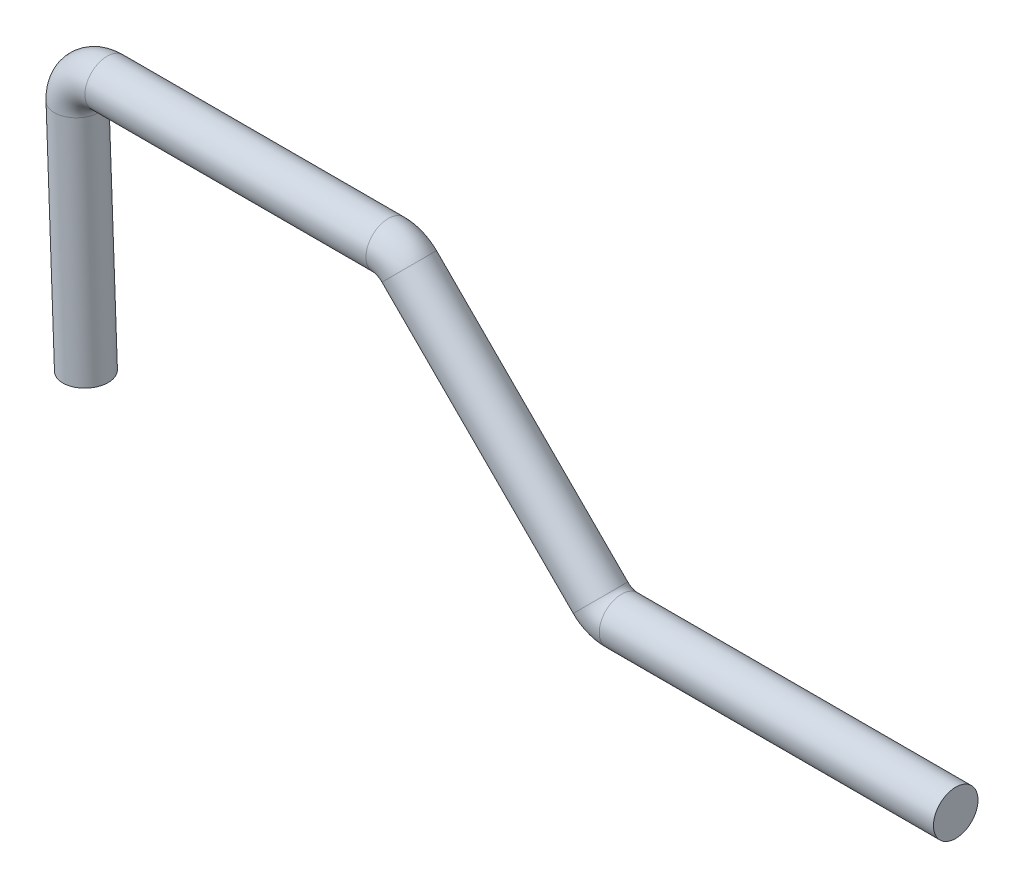
ISO-10303-21;
HEADER;
FILE_DESCRIPTION(('STEP AP214'),'2;1');
FILE_NAME('part.step','',(''),(''),'','','');
FILE_SCHEMA(('AUTOMOTIVE_DESIGN { 1 0 10303 214 1 1 1 1 }'));
ENDSEC;
DATA;
#1=APPLICATION_CONTEXT('core data for automotive mechanical design processes');
#2=APPLICATION_PROTOCOL_DEFINITION('international standard','automotive_design',2000,#1);
#3=PRODUCT_CONTEXT('',#1,'mechanical');
#4=PRODUCT('Part','Part','',(#3));
#5=PRODUCT_RELATED_PRODUCT_CATEGORY('part','',(#4));
#6=PRODUCT_DEFINITION_FORMATION('','',#4);
#7=PRODUCT_DEFINITION_CONTEXT('part definition',#1,'design');
#8=PRODUCT_DEFINITION('design','',#6,#7);
#9=PRODUCT_DEFINITION_SHAPE('','',#8);
#10=(LENGTH_UNIT() NAMED_UNIT(*) SI_UNIT(.MILLI.,.METRE.));
#11=(NAMED_UNIT(*) PLANE_ANGLE_UNIT() SI_UNIT($,.RADIAN.));
#12=(NAMED_UNIT(*) SI_UNIT($,.STERADIAN.) SOLID_ANGLE_UNIT());
#13=UNCERTAINTY_MEASURE_WITH_UNIT(LENGTH_MEASURE(1.E-05),#10,'distance_accuracy_value','');
#14=(GEOMETRIC_REPRESENTATION_CONTEXT(3) GLOBAL_UNCERTAINTY_ASSIGNED_CONTEXT((#13)) GLOBAL_UNIT_ASSIGNED_CONTEXT((#10,
#11,#12)) REPRESENTATION_CONTEXT('',''));
#15=CARTESIAN_POINT('',(0.,0.,0.));
#16=DIRECTION('',(0.,0.,1.));
#17=DIRECTION('',(1.,0.,0.));
#18=AXIS2_PLACEMENT_3D('',#15,#16,#17);
#19=CARTESIAN_POINT('',(0.,0.,0.));
#20=DIRECTION('',(1.,0.,0.));
#21=DIRECTION('',(0.,0.,-1.));
#22=AXIS2_PLACEMENT_3D('',#19,#20,#21);
#23=PLANE('',#22);
#24=CARTESIAN_POINT('',(0.,0.,0.));
#25=DIRECTION('',(1.,0.,0.));
#26=DIRECTION('',(0.,0.,-1.));
#27=AXIS2_PLACEMENT_3D('',#24,#25,#26);
#28=CIRCLE('',#27,7.5);
#29=CARTESIAN_POINT('',(0.,0.,-7.5));
#30=VERTEX_POINT('',#29);
#31=EDGE_CURVE('E59',#30,#30,#28,.T.);
#32=ORIENTED_EDGE('',*,*,#31,.T.);
#33=EDGE_LOOP('',(#32));
#34=FACE_BOUND('',#33,.T.);
#35=ADVANCED_FACE('F31',(#34),#23,.T.);
#36=CARTESIAN_POINT('',(-292.90806010988,-17.5079670244998,0.));
#37=DIRECTION('',(-0.0369440322759263,0.999317336224683,0.));
#38=DIRECTION('',(0.,0.,-1.));
#39=AXIS2_PLACEMENT_3D('',#36,#37,#38);
#40=PLANE('',#39);
#41=CARTESIAN_POINT('',(-292.90806010988,-17.5079670244998,0.));
#42=DIRECTION('',(-0.0369440322759263,0.999317336224683,0.));
#43=DIRECTION('',(0.,0.,-1.));
#44=AXIS2_PLACEMENT_3D('',#41,#42,#43);
#45=CIRCLE('',#44,7.5);
#46=CARTESIAN_POINT('',(-292.90806010988,-17.5079670244998,-7.5));
#47=VERTEX_POINT('',#46);
#48=EDGE_CURVE('E10',#47,#47,#45,.T.);
#49=ORIENTED_EDGE('',*,*,#48,.F.);
#50=EDGE_LOOP('',(#49));
#51=FACE_BOUND('',#50,.T.);
#52=ADVANCED_FACE('F67',(#51),#40,.F.);
#53=CARTESIAN_POINT('',(0.,0.,0.));
#54=DIRECTION('',(-1.,0.,0.));
#55=DIRECTION('',(0.,0.,1.));
#56=AXIS2_PLACEMENT_3D('',#53,#54,#55);
#57=CYLINDRICAL_SURFACE('',#56,7.5);
#58=CARTESIAN_POINT('',(-112.552079249219,0.,0.));
#59=DIRECTION('',(1.,0.,0.));
#60=DIRECTION('',(0.,0.,-1.));
#61=AXIS2_PLACEMENT_3D('',#58,#59,#60);
#62=CIRCLE('',#61,7.5);
#63=CARTESIAN_POINT('',(-112.552079249219,-7.5,0.));
#64=VERTEX_POINT('',#63);
#65=EDGE_CURVE('E56',#64,#64,#62,.T.);
#66=ORIENTED_EDGE('',*,*,#65,.T.);
#67=EDGE_LOOP('',(#66));
#68=FACE_BOUND('',#67,.T.);
#69=ORIENTED_EDGE('',*,*,#31,.F.);
#70=EDGE_LOOP('',(#69));
#71=FACE_BOUND('',#70,.T.);
#72=ADVANCED_FACE('F64',(#68,#71),#57,.T.);
#73=CARTESIAN_POINT('',(-112.552079249219,10.,0.));
#74=DIRECTION('',(0.,0.,-1.));
#75=DIRECTION('',(-1.,0.,0.));
#76=AXIS2_PLACEMENT_3D('',#73,#74,#75);
#77=TOROIDAL_SURFACE('',#76,10.,7.5);
#78=CARTESIAN_POINT('',(-119.623147061085,2.92893218813448,0.));
#79=DIRECTION('',(0.707106781186552,-0.707106781186543,0.));
#80=DIRECTION('',(0.,0.,-1.));
#81=AXIS2_PLACEMENT_3D('',#78,#79,#80);
#82=CIRCLE('',#81,7.5);
#83=CARTESIAN_POINT('',(-124.926447919984,-2.37436867076466,0.));
#84=VERTEX_POINT('',#83);
#85=EDGE_CURVE('E53',#84,#84,#82,.T.);
#86=CARTESIAN_POINT('',(-112.552079249219,10.,0.));
#87=DIRECTION('',(0.,0.,-1.));
#88=DIRECTION('',(-1.,0.,0.));
#89=AXIS2_PLACEMENT_3D('',#86,#87,#88);
#90=CIRCLE('',#89,17.5);
#91=EDGE_CURVE('',#64,#84,#90,.T.);
#92=ORIENTED_EDGE('',*,*,#65,.F.);
#93=ORIENTED_EDGE('',*,*,#85,.T.);
#94=ORIENTED_EDGE('',*,*,#91,.T.);
#95=ORIENTED_EDGE('',*,*,#91,.F.);
#96=EDGE_LOOP('',(#92,#94,#93,#95));
#97=FACE_BOUND('',#96,.T.);
#98=ADVANCED_FACE('F66',(#97),#77,.T.);
#99=CARTESIAN_POINT('',(-119.623147061085,2.92893218813448,0.));
#100=DIRECTION('',(-0.707106781186551,0.707106781186544,0.));
#101=DIRECTION('',(-0.707106781186544,-0.707106781186551,0.));
#102=AXIS2_PLACEMENT_3D('',#99,#100,#101);
#103=CYLINDRICAL_SURFACE('',#102,7.5);
#104=CARTESIAN_POINT('',(-184.039505872149,67.3452909991982,0.));
#105=DIRECTION('',(0.707106781186551,-0.707106781186544,0.));
#106=DIRECTION('',(0.,0.,-1.));
#107=AXIS2_PLACEMENT_3D('',#104,#105,#106);
#108=CIRCLE('',#107,7.5);
#109=CARTESIAN_POINT('',(-178.73620501325,72.6485918580973,0.));
#110=VERTEX_POINT('',#109);
#111=EDGE_CURVE('E50',#110,#110,#108,.T.);
#112=ORIENTED_EDGE('',*,*,#111,.T.);
#113=EDGE_LOOP('',(#112));
#114=FACE_BOUND('',#113,.T.);
#115=ORIENTED_EDGE('',*,*,#85,.F.);
#116=EDGE_LOOP('',(#115));
#117=FACE_BOUND('',#116,.T.);
#118=ADVANCED_FACE('F74',(#114,#117),#103,.T.);
#119=CARTESIAN_POINT('',(-191.110573684015,60.2742231873327,0.));
#120=DIRECTION('',(0.,0.,1.));
#121=DIRECTION('',(1.,0.,0.));
#122=AXIS2_PLACEMENT_3D('',#119,#120,#121);
#123=TOROIDAL_SURFACE('',#122,10.,7.5);
#124=CARTESIAN_POINT('',(-191.110573684015,70.2742231873327,0.));
#125=DIRECTION('',(1.,0.,0.));
#126=DIRECTION('',(0.,0.,-1.));
#127=AXIS2_PLACEMENT_3D('',#124,#125,#126);
#128=CIRCLE('',#127,7.5);
#129=CARTESIAN_POINT('',(-191.110573684015,77.7742231873327,0.));
#130=VERTEX_POINT('',#129);
#131=EDGE_CURVE('E45',#130,#130,#128,.T.);
#132=CARTESIAN_POINT('',(-191.110573684015,60.2742231873327,0.));
#133=DIRECTION('',(0.,0.,1.));
#134=DIRECTION('',(1.,0.,0.));
#135=AXIS2_PLACEMENT_3D('',#132,#133,#134);
#136=CIRCLE('',#135,17.5);
#137=EDGE_CURVE('',#110,#130,#136,.T.);
#138=ORIENTED_EDGE('',*,*,#111,.F.);
#139=ORIENTED_EDGE('',*,*,#131,.T.);
#140=ORIENTED_EDGE('',*,*,#137,.T.);
#141=ORIENTED_EDGE('',*,*,#137,.F.);
#142=EDGE_LOOP('',(#138,#140,#139,#141));
#143=FACE_BOUND('',#142,.T.);
#144=ADVANCED_FACE('F91',(#143),#123,.T.);
#145=CARTESIAN_POINT('',(-191.110573684015,70.2742231873327,0.));
#146=DIRECTION('',(-1.,0.,0.));
#147=DIRECTION('',(0.,0.,1.));
#148=AXIS2_PLACEMENT_3D('',#145,#146,#147);
#149=CYLINDRICAL_SURFACE('',#148,7.5);
#150=CARTESIAN_POINT('',(-285.776779588675,70.2742231873327,0.));
#151=DIRECTION('',(1.,0.,0.));
#152=DIRECTION('',(0.,0.,-1.));
#153=AXIS2_PLACEMENT_3D('',#150,#151,#152);
#154=CIRCLE('',#153,7.5);
#155=CARTESIAN_POINT('',(-285.776779588675,77.7742231873327,0.));
#156=VERTEX_POINT('',#155);
#157=EDGE_CURVE('E41',#156,#156,#154,.T.);
#158=ORIENTED_EDGE('',*,*,#157,.T.);
#159=EDGE_LOOP('',(#158));
#160=FACE_BOUND('',#159,.T.);
#161=ORIENTED_EDGE('',*,*,#131,.F.);
#162=EDGE_LOOP('',(#161));
#163=FACE_BOUND('',#162,.T.);
#164=ADVANCED_FACE('F85',(#160,#163),#149,.T.);
#165=CARTESIAN_POINT('',(-285.776779588675,60.2742231873327,0.));
#166=DIRECTION('',(0.,0.,1.));
#167=DIRECTION('',(1.,0.,0.));
#168=AXIS2_PLACEMENT_3D('',#165,#166,#167);
#169=TOROIDAL_SURFACE('',#168,9.99999999999999,7.5);
#170=CARTESIAN_POINT('',(-295.769952950922,59.9047828645734,0.));
#171=DIRECTION('',(-0.036944032275927,0.999317336224683,0.));
#172=DIRECTION('',(0.,0.,-1.));
#173=AXIS2_PLACEMENT_3D('',#170,#171,#172);
#174=CIRCLE('',#173,7.5);
#175=CARTESIAN_POINT('',(-303.264832972607,59.6277026225039,0.));
#176=VERTEX_POINT('',#175);
#177=EDGE_CURVE('E37',#176,#176,#174,.T.);
#178=CARTESIAN_POINT('',(-285.776779588675,60.2742231873327,0.));
#179=DIRECTION('',(0.,0.,1.));
#180=DIRECTION('',(1.,0.,0.));
#181=AXIS2_PLACEMENT_3D('',#178,#179,#180);
#182=CIRCLE('',#181,17.5);
#183=EDGE_CURVE('',#156,#176,#182,.T.);
#184=ORIENTED_EDGE('',*,*,#157,.F.);
#185=ORIENTED_EDGE('',*,*,#177,.T.);
#186=ORIENTED_EDGE('',*,*,#183,.T.);
#187=ORIENTED_EDGE('',*,*,#183,.F.);
#188=EDGE_LOOP('',(#184,#186,#185,#187));
#189=FACE_BOUND('',#188,.T.);
#190=ADVANCED_FACE('F80',(#189),#169,.T.);
#191=CARTESIAN_POINT('',(-295.769952950922,59.9047828645734,0.));
#192=DIRECTION('',(0.0369440322759263,-0.999317336224683,0.));
#193=DIRECTION('',(0.999317336224683,0.0369440322759263,0.));
#194=AXIS2_PLACEMENT_3D('',#191,#192,#193);
#195=CYLINDRICAL_SURFACE('',#194,7.5);
#196=ORIENTED_EDGE('',*,*,#48,.T.);
#197=EDGE_LOOP('',(#196));
#198=FACE_BOUND('',#197,.T.);
#199=ORIENTED_EDGE('',*,*,#177,.F.);
#200=EDGE_LOOP('',(#199));
#201=FACE_BOUND('',#200,.T.);
#202=ADVANCED_FACE('F78',(#198,#201),#195,.T.);
#203=CLOSED_SHELL('',(#35,#52,#72,#98,#118,#144,#164,#190,#202));
#204=MANIFOLD_SOLID_BREP('B2',#203);
#205=ADVANCED_BREP_SHAPE_REPRESENTATION('',(#18,#204),#14);
#206=SHAPE_DEFINITION_REPRESENTATION(#9,#205);
ENDSEC;
END-ISO-10303-21;
